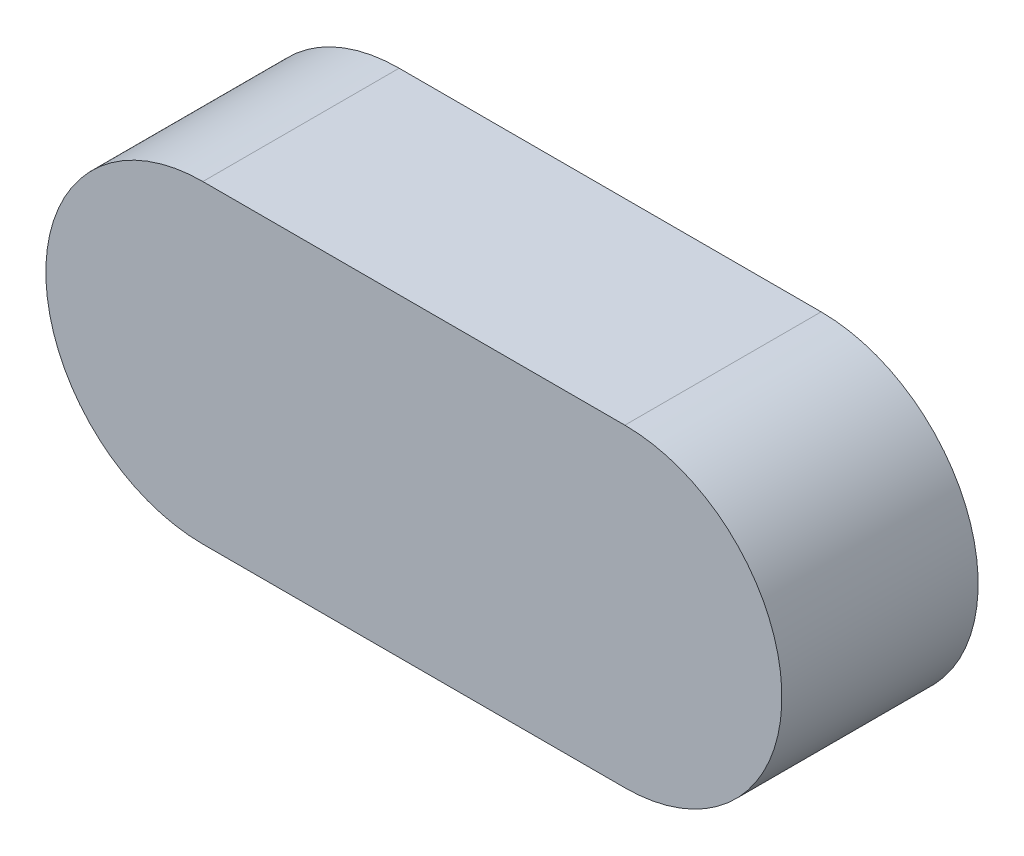
ISO-10303-21;
HEADER;
FILE_DESCRIPTION(('STEP AP214'),'2;1');
FILE_NAME('part.step','',(''),(''),'','','');
FILE_SCHEMA(('AUTOMOTIVE_DESIGN { 1 0 10303 214 1 1 1 1 }'));
ENDSEC;
DATA;
#1=APPLICATION_CONTEXT('core data for automotive mechanical design processes');
#2=APPLICATION_PROTOCOL_DEFINITION('international standard','automotive_design',2000,#1);
#3=PRODUCT_CONTEXT('',#1,'mechanical');
#4=PRODUCT('Part','Part','',(#3));
#5=PRODUCT_RELATED_PRODUCT_CATEGORY('part','',(#4));
#6=PRODUCT_DEFINITION_FORMATION('','',#4);
#7=PRODUCT_DEFINITION_CONTEXT('part definition',#1,'design');
#8=PRODUCT_DEFINITION('design','',#6,#7);
#9=PRODUCT_DEFINITION_SHAPE('','',#8);
#10=(LENGTH_UNIT() NAMED_UNIT(*) SI_UNIT(.MILLI.,.METRE.));
#11=(NAMED_UNIT(*) PLANE_ANGLE_UNIT() SI_UNIT($,.RADIAN.));
#12=(NAMED_UNIT(*) SI_UNIT($,.STERADIAN.) SOLID_ANGLE_UNIT());
#13=UNCERTAINTY_MEASURE_WITH_UNIT(LENGTH_MEASURE(1.E-05),#10,'distance_accuracy_value','');
#14=(GEOMETRIC_REPRESENTATION_CONTEXT(3) GLOBAL_UNCERTAINTY_ASSIGNED_CONTEXT((#13)) GLOBAL_UNIT_ASSIGNED_CONTEXT((#10,
#11,#12)) REPRESENTATION_CONTEXT('',''));
#15=CARTESIAN_POINT('',(0.,0.,0.));
#16=DIRECTION('',(0.,0.,1.));
#17=DIRECTION('',(1.,0.,0.));
#18=AXIS2_PLACEMENT_3D('',#15,#16,#17);
#19=CARTESIAN_POINT('',(-21.5,0.,20.));
#20=DIRECTION('',(0.,0.,-1.));
#21=DIRECTION('',(-1.,0.,0.));
#22=AXIS2_PLACEMENT_3D('',#19,#20,#21);
#23=CYLINDRICAL_SURFACE('',#22,16.);
#24=CARTESIAN_POINT('',(-21.5,0.,0.));
#25=DIRECTION('',(0.,0.,1.));
#26=DIRECTION('',(1.,0.,0.));
#27=AXIS2_PLACEMENT_3D('',#24,#25,#26);
#28=CIRCLE('',#27,16.);
#29=CARTESIAN_POINT('',(-21.5,16.,0.));
#30=VERTEX_POINT('',#29);
#31=CARTESIAN_POINT('',(-21.5,-16.,0.));
#32=VERTEX_POINT('',#31);
#33=EDGE_CURVE('E78',#30,#32,#28,.T.);
#34=ORIENTED_EDGE('',*,*,#33,.T.);
#35=DIRECTION('',(0.,0.,-1.));
#36=VECTOR('',#35,1.);
#37=CARTESIAN_POINT('',(-21.5,-16.,20.));
#38=LINE('',#37,#36);
#39=CARTESIAN_POINT('',(-21.5,-16.,20.));
#40=VERTEX_POINT('',#39);
#41=EDGE_CURVE('E11',#40,#32,#38,.T.);
#42=ORIENTED_EDGE('',*,*,#41,.F.);
#43=CARTESIAN_POINT('',(-21.5,0.,20.));
#44=DIRECTION('',(0.,0.,1.));
#45=DIRECTION('',(1.,0.,0.));
#46=AXIS2_PLACEMENT_3D('',#43,#44,#45);
#47=CIRCLE('',#46,16.);
#48=CARTESIAN_POINT('',(-21.5,16.,20.));
#49=VERTEX_POINT('',#48);
#50=EDGE_CURVE('E96',#49,#40,#47,.T.);
#51=ORIENTED_EDGE('',*,*,#50,.F.);
#52=DIRECTION('',(0.,0.,-1.));
#53=VECTOR('',#52,1.);
#54=CARTESIAN_POINT('',(-21.5,16.,20.));
#55=LINE('',#54,#53);
#56=EDGE_CURVE('E90',#49,#30,#55,.T.);
#57=ORIENTED_EDGE('',*,*,#56,.T.);
#58=EDGE_LOOP('',(#34,#42,#51,#57));
#59=FACE_BOUND('',#58,.T.);
#60=ADVANCED_FACE('F34',(#59),#23,.T.);
#61=CARTESIAN_POINT('',(-21.5,-16.,20.));
#62=DIRECTION('',(0.,1.,0.));
#63=DIRECTION('',(0.,0.,1.));
#64=AXIS2_PLACEMENT_3D('',#61,#62,#63);
#65=PLANE('',#64);
#66=DIRECTION('',(1.,0.,0.));
#67=VECTOR('',#66,1.);
#68=CARTESIAN_POINT('',(-21.5,-16.,0.));
#69=LINE('',#68,#67);
#70=CARTESIAN_POINT('',(21.5,-16.,0.));
#71=VERTEX_POINT('',#70);
#72=EDGE_CURVE('E74',#32,#71,#69,.T.);
#73=ORIENTED_EDGE('',*,*,#72,.T.);
#74=DIRECTION('',(0.,0.,-1.));
#75=VECTOR('',#74,1.);
#76=CARTESIAN_POINT('',(21.5,-16.,20.));
#77=LINE('',#76,#75);
#78=CARTESIAN_POINT('',(21.5,-16.,20.));
#79=VERTEX_POINT('',#78);
#80=EDGE_CURVE('E41',#79,#71,#77,.T.);
#81=ORIENTED_EDGE('',*,*,#80,.F.);
#82=DIRECTION('',(1.,0.,0.));
#83=VECTOR('',#82,1.);
#84=CARTESIAN_POINT('',(-21.5,-16.,20.));
#85=LINE('',#84,#83);
#86=EDGE_CURVE('E86',#40,#79,#85,.T.);
#87=ORIENTED_EDGE('',*,*,#86,.F.);
#88=ORIENTED_EDGE('',*,*,#41,.T.);
#89=EDGE_LOOP('',(#73,#81,#87,#88));
#90=FACE_BOUND('',#89,.T.);
#91=ADVANCED_FACE('F85',(#90),#65,.F.);
#92=CARTESIAN_POINT('',(21.5,0.,20.));
#93=DIRECTION('',(0.,0.,-1.));
#94=DIRECTION('',(-1.,0.,0.));
#95=AXIS2_PLACEMENT_3D('',#92,#93,#94);
#96=CYLINDRICAL_SURFACE('',#95,16.);
#97=CARTESIAN_POINT('',(21.5,0.,0.));
#98=DIRECTION('',(0.,0.,1.));
#99=DIRECTION('',(-1.,0.,0.));
#100=AXIS2_PLACEMENT_3D('',#97,#98,#99);
#101=CIRCLE('',#100,16.);
#102=CARTESIAN_POINT('',(21.5,16.,0.));
#103=VERTEX_POINT('',#102);
#104=EDGE_CURVE('E79',#71,#103,#101,.T.);
#105=ORIENTED_EDGE('',*,*,#104,.T.);
#106=DIRECTION('',(0.,0.,-1.));
#107=VECTOR('',#106,1.);
#108=CARTESIAN_POINT('',(21.5,16.,20.));
#109=LINE('',#108,#107);
#110=CARTESIAN_POINT('',(21.5,16.,20.));
#111=VERTEX_POINT('',#110);
#112=EDGE_CURVE('E102',#111,#103,#109,.T.);
#113=ORIENTED_EDGE('',*,*,#112,.F.);
#114=CARTESIAN_POINT('',(21.5,0.,20.));
#115=DIRECTION('',(0.,0.,1.));
#116=DIRECTION('',(-1.,0.,0.));
#117=AXIS2_PLACEMENT_3D('',#114,#115,#116);
#118=CIRCLE('',#117,16.);
#119=EDGE_CURVE('E53',#79,#111,#118,.T.);
#120=ORIENTED_EDGE('',*,*,#119,.F.);
#121=ORIENTED_EDGE('',*,*,#80,.T.);
#122=EDGE_LOOP('',(#105,#113,#120,#121));
#123=FACE_BOUND('',#122,.T.);
#124=ADVANCED_FACE('F105',(#123),#96,.T.);
#125=CARTESIAN_POINT('',(-21.5,16.,20.));
#126=DIRECTION('',(0.,-1.,0.));
#127=DIRECTION('',(0.,0.,-1.));
#128=AXIS2_PLACEMENT_3D('',#125,#126,#127);
#129=PLANE('',#128);
#130=DIRECTION('',(-1.,0.,0.));
#131=VECTOR('',#130,1.);
#132=CARTESIAN_POINT('',(-21.5,16.,0.));
#133=LINE('',#132,#131);
#134=EDGE_CURVE('E94',#103,#30,#133,.T.);
#135=ORIENTED_EDGE('',*,*,#134,.T.);
#136=ORIENTED_EDGE('',*,*,#56,.F.);
#137=DIRECTION('',(-1.,0.,0.));
#138=VECTOR('',#137,1.);
#139=CARTESIAN_POINT('',(-21.5,16.,20.));
#140=LINE('',#139,#138);
#141=EDGE_CURVE('E48',#111,#49,#140,.T.);
#142=ORIENTED_EDGE('',*,*,#141,.F.);
#143=ORIENTED_EDGE('',*,*,#112,.T.);
#144=EDGE_LOOP('',(#135,#136,#142,#143));
#145=FACE_BOUND('',#144,.T.);
#146=ADVANCED_FACE('F107',(#145),#129,.F.);
#147=CARTESIAN_POINT('',(-21.5,0.,20.));
#148=DIRECTION('',(0.,0.,1.));
#149=DIRECTION('',(1.,0.,0.));
#150=AXIS2_PLACEMENT_3D('',#147,#148,#149);
#151=PLANE('',#150);
#152=ORIENTED_EDGE('',*,*,#50,.T.);
#153=ORIENTED_EDGE('',*,*,#86,.T.);
#154=ORIENTED_EDGE('',*,*,#119,.T.);
#155=ORIENTED_EDGE('',*,*,#141,.T.);
#156=EDGE_LOOP('',(#152,#153,#154,#155));
#157=FACE_BOUND('',#156,.T.);
#158=ADVANCED_FACE('F108',(#157),#151,.T.);
#159=CARTESIAN_POINT('',(-21.5,0.,0.));
#160=DIRECTION('',(0.,0.,1.));
#161=DIRECTION('',(1.,0.,0.));
#162=AXIS2_PLACEMENT_3D('',#159,#160,#161);
#163=PLANE('',#162);
#164=ORIENTED_EDGE('',*,*,#33,.F.);
#165=ORIENTED_EDGE('',*,*,#134,.F.);
#166=ORIENTED_EDGE('',*,*,#104,.F.);
#167=ORIENTED_EDGE('',*,*,#72,.F.);
#168=EDGE_LOOP('',(#164,#165,#166,#167));
#169=FACE_BOUND('',#168,.T.);
#170=ADVANCED_FACE('F75',(#169),#163,.F.);
#171=CLOSED_SHELL('',(#60,#91,#124,#146,#158,#170));
#172=MANIFOLD_SOLID_BREP('B2',#171);
#173=ADVANCED_BREP_SHAPE_REPRESENTATION('',(#18,#172),#14);
#174=SHAPE_DEFINITION_REPRESENTATION(#9,#173);
ENDSEC;
END-ISO-10303-21;
